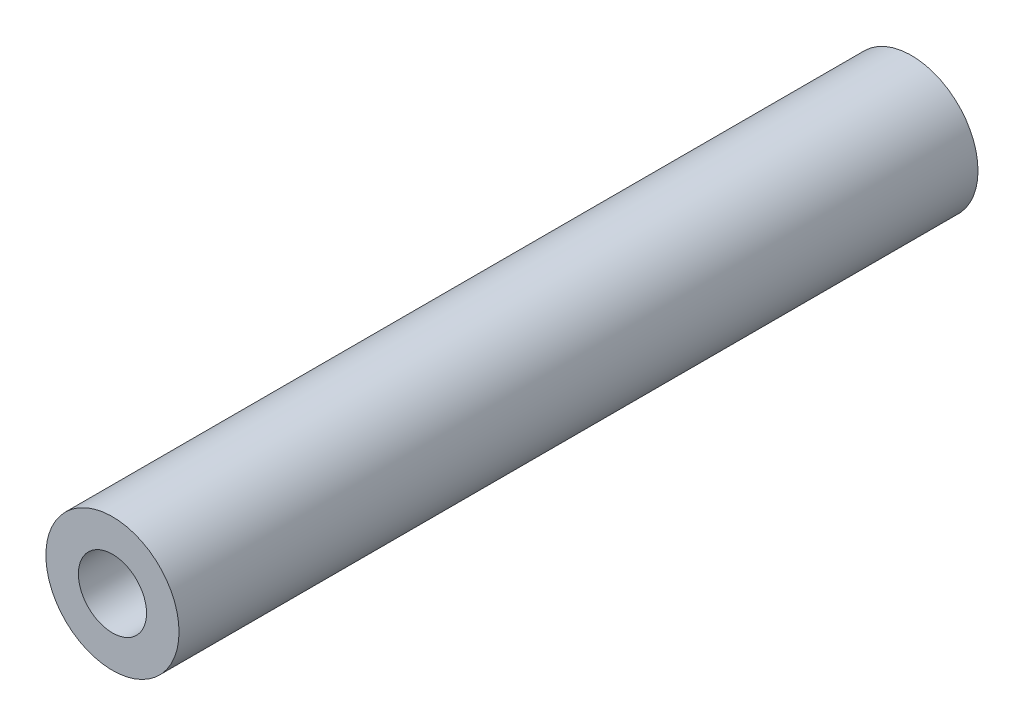
ISO-10303-21;
HEADER;
FILE_DESCRIPTION(('STEP AP214'),'2;1');
FILE_NAME('part.step','',(''),(''),'','','');
FILE_SCHEMA(('AUTOMOTIVE_DESIGN { 1 0 10303 214 1 1 1 1 }'));
ENDSEC;
DATA;
#1=APPLICATION_CONTEXT('core data for automotive mechanical design processes');
#2=APPLICATION_PROTOCOL_DEFINITION('international standard','automotive_design',2000,#1);
#3=PRODUCT_CONTEXT('',#1,'mechanical');
#4=PRODUCT('Part','Part','',(#3));
#5=PRODUCT_RELATED_PRODUCT_CATEGORY('part','',(#4));
#6=PRODUCT_DEFINITION_FORMATION('','',#4);
#7=PRODUCT_DEFINITION_CONTEXT('part definition',#1,'design');
#8=PRODUCT_DEFINITION('design','',#6,#7);
#9=PRODUCT_DEFINITION_SHAPE('','',#8);
#10=(LENGTH_UNIT() NAMED_UNIT(*) SI_UNIT(.MILLI.,.METRE.));
#11=(NAMED_UNIT(*) PLANE_ANGLE_UNIT() SI_UNIT($,.RADIAN.));
#12=(NAMED_UNIT(*) SI_UNIT($,.STERADIAN.) SOLID_ANGLE_UNIT());
#13=UNCERTAINTY_MEASURE_WITH_UNIT(LENGTH_MEASURE(1.E-05),#10,'distance_accuracy_value','');
#14=(GEOMETRIC_REPRESENTATION_CONTEXT(3) GLOBAL_UNCERTAINTY_ASSIGNED_CONTEXT((#13)) GLOBAL_UNIT_ASSIGNED_CONTEXT((#10,
#11,#12)) REPRESENTATION_CONTEXT('',''));
#15=CARTESIAN_POINT('',(0.,0.,0.));
#16=DIRECTION('',(0.,0.,1.));
#17=DIRECTION('',(1.,0.,0.));
#18=AXIS2_PLACEMENT_3D('',#15,#16,#17);
#19=CARTESIAN_POINT('',(0.,0.,28.575));
#20=DIRECTION('',(0.,0.,1.));
#21=DIRECTION('',(1.,0.,0.));
#22=AXIS2_PLACEMENT_3D('',#19,#20,#21);
#23=PLANE('',#22);
#24=CARTESIAN_POINT('',(0.,0.,28.575));
#25=DIRECTION('',(0.,0.,1.));
#26=DIRECTION('',(1.,0.,0.));
#27=AXIS2_PLACEMENT_3D('',#24,#25,#26);
#28=CIRCLE('',#27,4.7625);
#29=CARTESIAN_POINT('',(4.7625,0.,28.575));
#30=VERTEX_POINT('',#29);
#31=EDGE_CURVE('E10',#30,#30,#28,.T.);
#32=ORIENTED_EDGE('',*,*,#31,.T.);
#33=EDGE_LOOP('',(#32));
#34=FACE_BOUND('',#33,.T.);
#35=CARTESIAN_POINT('',(0.,0.,28.575));
#36=DIRECTION('',(0.,0.,1.));
#37=DIRECTION('',(1.,0.,0.));
#38=AXIS2_PLACEMENT_3D('',#35,#36,#37);
#39=CIRCLE('',#38,2.4384);
#40=CARTESIAN_POINT('',(2.4384,0.,28.575));
#41=VERTEX_POINT('',#40);
#42=EDGE_CURVE('E41',#41,#41,#39,.T.);
#43=ORIENTED_EDGE('',*,*,#42,.F.);
#44=EDGE_LOOP('',(#43));
#45=FACE_BOUND('',#44,.T.);
#46=ADVANCED_FACE('F30',(#34,#45),#23,.T.);
#47=CARTESIAN_POINT('',(0.,0.,-28.575));
#48=DIRECTION('',(0.,0.,1.));
#49=DIRECTION('',(1.,0.,0.));
#50=AXIS2_PLACEMENT_3D('',#47,#48,#49);
#51=PLANE('',#50);
#52=CARTESIAN_POINT('',(0.,0.,-28.575));
#53=DIRECTION('',(0.,0.,1.));
#54=DIRECTION('',(1.,0.,0.));
#55=AXIS2_PLACEMENT_3D('',#52,#53,#54);
#56=CIRCLE('',#55,4.7625);
#57=CARTESIAN_POINT('',(4.7625,0.,-28.575));
#58=VERTEX_POINT('',#57);
#59=EDGE_CURVE('E34',#58,#58,#56,.T.);
#60=ORIENTED_EDGE('',*,*,#59,.F.);
#61=EDGE_LOOP('',(#60));
#62=FACE_BOUND('',#61,.T.);
#63=CARTESIAN_POINT('',(0.,0.,-28.575));
#64=DIRECTION('',(0.,0.,1.));
#65=DIRECTION('',(1.,0.,0.));
#66=AXIS2_PLACEMENT_3D('',#63,#64,#65);
#67=CIRCLE('',#66,2.4384);
#68=CARTESIAN_POINT('',(2.4384,0.,-28.575));
#69=VERTEX_POINT('',#68);
#70=EDGE_CURVE('E43',#69,#69,#67,.T.);
#71=ORIENTED_EDGE('',*,*,#70,.T.);
#72=EDGE_LOOP('',(#71));
#73=FACE_BOUND('',#72,.T.);
#74=ADVANCED_FACE('F53',(#62,#73),#51,.F.);
#75=CARTESIAN_POINT('',(0.,0.,28.575));
#76=DIRECTION('',(0.,0.,-1.));
#77=DIRECTION('',(-1.,0.,0.));
#78=AXIS2_PLACEMENT_3D('',#75,#76,#77);
#79=CYLINDRICAL_SURFACE('',#78,4.7625);
#80=ORIENTED_EDGE('',*,*,#31,.F.);
#81=EDGE_LOOP('',(#80));
#82=FACE_BOUND('',#81,.T.);
#83=ORIENTED_EDGE('',*,*,#59,.T.);
#84=EDGE_LOOP('',(#83));
#85=FACE_BOUND('',#84,.T.);
#86=ADVANCED_FACE('F32',(#82,#85),#79,.T.);
#87=CARTESIAN_POINT('',(0.,0.,28.575));
#88=DIRECTION('',(0.,0.,-1.));
#89=DIRECTION('',(-1.,0.,0.));
#90=AXIS2_PLACEMENT_3D('',#87,#88,#89);
#91=CYLINDRICAL_SURFACE('',#90,2.4384);
#92=ORIENTED_EDGE('',*,*,#42,.T.);
#93=EDGE_LOOP('',(#92));
#94=FACE_BOUND('',#93,.T.);
#95=ORIENTED_EDGE('',*,*,#70,.F.);
#96=EDGE_LOOP('',(#95));
#97=FACE_BOUND('',#96,.T.);
#98=ADVANCED_FACE('F49',(#94,#97),#91,.F.);
#99=CLOSED_SHELL('',(#46,#74,#86,#98));
#100=MANIFOLD_SOLID_BREP('B2',#99);
#101=ADVANCED_BREP_SHAPE_REPRESENTATION('',(#18,#100),#14);
#102=SHAPE_DEFINITION_REPRESENTATION(#9,#101);
ENDSEC;
END-ISO-10303-21;
